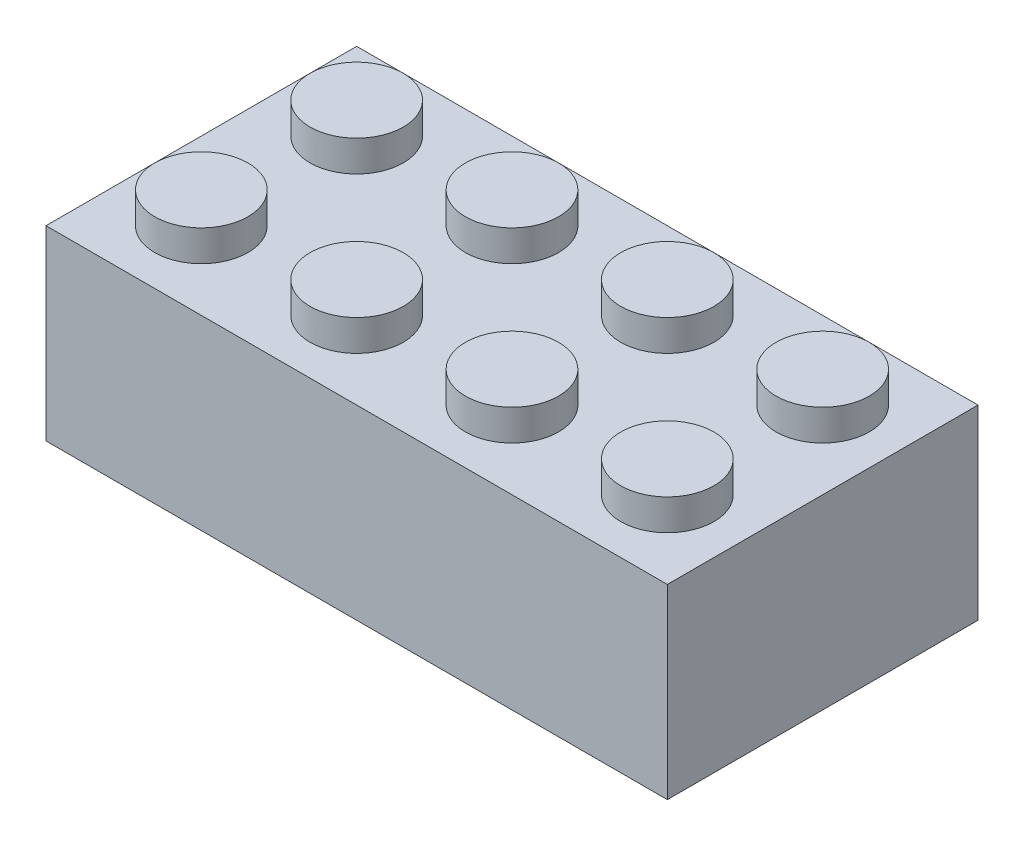
ISO-10303-21;
HEADER;
FILE_DESCRIPTION(('STEP AP214'),'2;1');
FILE_NAME('part.step','',(''),(''),'','','');
FILE_SCHEMA(('AUTOMOTIVE_DESIGN { 1 0 10303 214 1 1 1 1 }'));
ENDSEC;
DATA;
#1=APPLICATION_CONTEXT('core data for automotive mechanical design processes');
#2=APPLICATION_PROTOCOL_DEFINITION('international standard','automotive_design',2000,#1);
#3=PRODUCT_CONTEXT('',#1,'mechanical');
#4=PRODUCT('Part','Part','',(#3));
#5=PRODUCT_RELATED_PRODUCT_CATEGORY('part','',(#4));
#6=PRODUCT_DEFINITION_FORMATION('','',#4);
#7=PRODUCT_DEFINITION_CONTEXT('part definition',#1,'design');
#8=PRODUCT_DEFINITION('design','',#6,#7);
#9=PRODUCT_DEFINITION_SHAPE('','',#8);
#10=(LENGTH_UNIT() NAMED_UNIT(*) SI_UNIT(.MILLI.,.METRE.));
#11=(NAMED_UNIT(*) PLANE_ANGLE_UNIT() SI_UNIT($,.RADIAN.));
#12=(NAMED_UNIT(*) SI_UNIT($,.STERADIAN.) SOLID_ANGLE_UNIT());
#13=UNCERTAINTY_MEASURE_WITH_UNIT(LENGTH_MEASURE(1.E-05),#10,'distance_accuracy_value','');
#14=(GEOMETRIC_REPRESENTATION_CONTEXT(3) GLOBAL_UNCERTAINTY_ASSIGNED_CONTEXT((#13)) GLOBAL_UNIT_ASSIGNED_CONTEXT((#10,
#11,#12)) REPRESENTATION_CONTEXT('',''));
#15=CARTESIAN_POINT('',(0.,0.,0.));
#16=DIRECTION('',(0.,0.,1.));
#17=DIRECTION('',(1.,0.,0.));
#18=AXIS2_PLACEMENT_3D('',#15,#16,#17);
#19=CARTESIAN_POINT('',(28.,4.8,4.));
#20=DIRECTION('',(-1.,0.,0.));
#21=DIRECTION('',(0.,0.,1.));
#22=AXIS2_PLACEMENT_3D('',#19,#20,#21);
#23=PLANE('',#22);
#24=DIRECTION('',(0.,0.,-1.));
#25=VECTOR('',#24,1.);
#26=CARTESIAN_POINT('',(28.,0.,4.));
#27=LINE('',#26,#25);
#28=CARTESIAN_POINT('',(28.,0.,12.));
#29=VERTEX_POINT('',#28);
#30=CARTESIAN_POINT('',(28.,0.,-4.));
#31=VERTEX_POINT('',#30);
#32=EDGE_CURVE('E185',#29,#31,#27,.T.);
#33=ORIENTED_EDGE('',*,*,#32,.T.);
#34=DIRECTION('',(0.,-1.,0.));
#35=VECTOR('',#34,1.);
#36=CARTESIAN_POINT('',(28.,4.8,-4.));
#37=LINE('',#36,#35);
#38=CARTESIAN_POINT('',(28.,9.6,-4.));
#39=VERTEX_POINT('',#38);
#40=EDGE_CURVE('E243',#39,#31,#37,.T.);
#41=ORIENTED_EDGE('',*,*,#40,.F.);
#42=DIRECTION('',(0.,0.,-1.));
#43=VECTOR('',#42,1.);
#44=CARTESIAN_POINT('',(28.,9.6,4.));
#45=LINE('',#44,#43);
#46=CARTESIAN_POINT('',(28.,9.6,12.));
#47=VERTEX_POINT('',#46);
#48=EDGE_CURVE('E11',#47,#39,#45,.T.);
#49=ORIENTED_EDGE('',*,*,#48,.F.);
#50=DIRECTION('',(0.,1.,0.));
#51=VECTOR('',#50,1.);
#52=CARTESIAN_POINT('',(28.,4.8,12.));
#53=LINE('',#52,#51);
#54=EDGE_CURVE('E208',#29,#47,#53,.T.);
#55=ORIENTED_EDGE('',*,*,#54,.F.);
#56=EDGE_LOOP('',(#33,#41,#49,#55));
#57=FACE_BOUND('',#56,.T.);
#58=ADVANCED_FACE('F17',(#57),#23,.F.);
#59=CARTESIAN_POINT('',(12.,9.6,4.));
#60=DIRECTION('',(0.,-1.,0.));
#61=DIRECTION('',(0.,0.,-1.));
#62=AXIS2_PLACEMENT_3D('',#59,#60,#61);
#63=PLANE('',#62);
#64=ORIENTED_EDGE('',*,*,#48,.T.);
#65=DIRECTION('',(1.,0.,0.));
#66=VECTOR('',#65,1.);
#67=CARTESIAN_POINT('',(12.,9.6,-4.));
#68=LINE('',#67,#66);
#69=CARTESIAN_POINT('',(-4.,9.6,-4.));
#70=VERTEX_POINT('',#69);
#71=EDGE_CURVE('E250',#70,#39,#68,.T.);
#72=ORIENTED_EDGE('',*,*,#71,.F.);
#73=DIRECTION('',(0.,0.,-1.));
#74=VECTOR('',#73,1.);
#75=CARTESIAN_POINT('',(-4.,9.6,4.));
#76=LINE('',#75,#74);
#77=CARTESIAN_POINT('',(-4.,9.6,12.));
#78=VERTEX_POINT('',#77);
#79=EDGE_CURVE('E27',#78,#70,#76,.T.);
#80=ORIENTED_EDGE('',*,*,#79,.F.);
#81=DIRECTION('',(-1.,0.,0.));
#82=VECTOR('',#81,1.);
#83=CARTESIAN_POINT('',(12.,9.6,12.));
#84=LINE('',#83,#82);
#85=EDGE_CURVE('E184',#47,#78,#84,.T.);
#86=ORIENTED_EDGE('',*,*,#85,.F.);
#87=EDGE_LOOP('',(#64,#72,#80,#86));
#88=FACE_BOUND('',#87,.T.);
#89=CARTESIAN_POINT('',(0.,9.6,0.));
#90=DIRECTION('',(0.,-1.,0.));
#91=DIRECTION('',(1.,0.,0.));
#92=AXIS2_PLACEMENT_3D('',#89,#90,#91);
#93=CIRCLE('',#92,2.4);
#94=CARTESIAN_POINT('',(-2.4,9.6,0.));
#95=VERTEX_POINT('',#94);
#96=EDGE_CURVE('E211',#95,#95,#93,.T.);
#97=ORIENTED_EDGE('',*,*,#96,.T.);
#98=EDGE_LOOP('',(#97));
#99=FACE_BOUND('',#98,.T.);
#100=CARTESIAN_POINT('',(0.,9.6,8.));
#101=DIRECTION('',(0.,-1.,0.));
#102=DIRECTION('',(1.,0.,0.));
#103=AXIS2_PLACEMENT_3D('',#100,#101,#102);
#104=CIRCLE('',#103,2.4);
#105=CARTESIAN_POINT('',(-2.4,9.6,8.));
#106=VERTEX_POINT('',#105);
#107=EDGE_CURVE('E249',#106,#106,#104,.T.);
#108=ORIENTED_EDGE('',*,*,#107,.T.);
#109=EDGE_LOOP('',(#108));
#110=FACE_BOUND('',#109,.T.);
#111=CARTESIAN_POINT('',(8.,9.6,0.));
#112=DIRECTION('',(0.,-1.,0.));
#113=DIRECTION('',(1.,0.,0.));
#114=AXIS2_PLACEMENT_3D('',#111,#112,#113);
#115=CIRCLE('',#114,2.4);
#116=CARTESIAN_POINT('',(5.6,9.6,0.));
#117=VERTEX_POINT('',#116);
#118=EDGE_CURVE('E172',#117,#117,#115,.T.);
#119=ORIENTED_EDGE('',*,*,#118,.T.);
#120=EDGE_LOOP('',(#119));
#121=FACE_BOUND('',#120,.T.);
#122=CARTESIAN_POINT('',(8.,9.6,8.));
#123=DIRECTION('',(0.,-1.,0.));
#124=DIRECTION('',(1.,0.,0.));
#125=AXIS2_PLACEMENT_3D('',#122,#123,#124);
#126=CIRCLE('',#125,2.4);
#127=CARTESIAN_POINT('',(5.6,9.6,8.));
#128=VERTEX_POINT('',#127);
#129=EDGE_CURVE('E165',#128,#128,#126,.T.);
#130=ORIENTED_EDGE('',*,*,#129,.T.);
#131=EDGE_LOOP('',(#130));
#132=FACE_BOUND('',#131,.T.);
#133=CARTESIAN_POINT('',(16.,9.6,0.));
#134=DIRECTION('',(0.,-1.,0.));
#135=DIRECTION('',(1.,0.,0.));
#136=AXIS2_PLACEMENT_3D('',#133,#134,#135);
#137=CIRCLE('',#136,2.4);
#138=CARTESIAN_POINT('',(13.6,9.6,0.));
#139=VERTEX_POINT('',#138);
#140=EDGE_CURVE('E174',#139,#139,#137,.T.);
#141=ORIENTED_EDGE('',*,*,#140,.T.);
#142=EDGE_LOOP('',(#141));
#143=FACE_BOUND('',#142,.T.);
#144=CARTESIAN_POINT('',(16.,9.6,8.));
#145=DIRECTION('',(0.,-1.,0.));
#146=DIRECTION('',(1.,0.,0.));
#147=AXIS2_PLACEMENT_3D('',#144,#145,#146);
#148=CIRCLE('',#147,2.4);
#149=CARTESIAN_POINT('',(13.6,9.6,8.));
#150=VERTEX_POINT('',#149);
#151=EDGE_CURVE('E260',#150,#150,#148,.T.);
#152=ORIENTED_EDGE('',*,*,#151,.T.);
#153=EDGE_LOOP('',(#152));
#154=FACE_BOUND('',#153,.T.);
#155=CARTESIAN_POINT('',(24.,9.6,0.));
#156=DIRECTION('',(0.,-1.,0.));
#157=DIRECTION('',(1.,0.,0.));
#158=AXIS2_PLACEMENT_3D('',#155,#156,#157);
#159=CIRCLE('',#158,2.4);
#160=CARTESIAN_POINT('',(21.6,9.6,0.));
#161=VERTEX_POINT('',#160);
#162=EDGE_CURVE('E220',#161,#161,#159,.T.);
#163=ORIENTED_EDGE('',*,*,#162,.T.);
#164=EDGE_LOOP('',(#163));
#165=FACE_BOUND('',#164,.T.);
#166=CARTESIAN_POINT('',(24.,9.6,8.));
#167=DIRECTION('',(0.,-1.,0.));
#168=DIRECTION('',(1.,0.,0.));
#169=AXIS2_PLACEMENT_3D('',#166,#167,#168);
#170=CIRCLE('',#169,2.4);
#171=CARTESIAN_POINT('',(21.6,9.6,8.));
#172=VERTEX_POINT('',#171);
#173=EDGE_CURVE('E191',#172,#172,#170,.T.);
#174=ORIENTED_EDGE('',*,*,#173,.T.);
#175=EDGE_LOOP('',(#174));
#176=FACE_BOUND('',#175,.T.);
#177=ADVANCED_FACE('F166',(#88,#99,#110,#121,#132,#143,#154,#165,#176),#63,.F.);
#178=CARTESIAN_POINT('',(-4.,4.8,4.));
#179=DIRECTION('',(1.,0.,0.));
#180=DIRECTION('',(0.,0.,-1.));
#181=AXIS2_PLACEMENT_3D('',#178,#179,#180);
#182=PLANE('',#181);
#183=ORIENTED_EDGE('',*,*,#79,.T.);
#184=DIRECTION('',(0.,1.,0.));
#185=VECTOR('',#184,1.);
#186=CARTESIAN_POINT('',(-4.,4.8,-4.));
#187=LINE('',#186,#185);
#188=CARTESIAN_POINT('',(-4.,0.,-4.));
#189=VERTEX_POINT('',#188);
#190=EDGE_CURVE('E253',#189,#70,#187,.T.);
#191=ORIENTED_EDGE('',*,*,#190,.F.);
#192=DIRECTION('',(0.,0.,-1.));
#193=VECTOR('',#192,1.);
#194=CARTESIAN_POINT('',(-4.,0.,4.));
#195=LINE('',#194,#193);
#196=CARTESIAN_POINT('',(-4.,0.,12.));
#197=VERTEX_POINT('',#196);
#198=EDGE_CURVE('E188',#197,#189,#195,.T.);
#199=ORIENTED_EDGE('',*,*,#198,.F.);
#200=DIRECTION('',(0.,-1.,0.));
#201=VECTOR('',#200,1.);
#202=CARTESIAN_POINT('',(-4.,4.8,12.));
#203=LINE('',#202,#201);
#204=EDGE_CURVE('E180',#78,#197,#203,.T.);
#205=ORIENTED_EDGE('',*,*,#204,.F.);
#206=EDGE_LOOP('',(#183,#191,#199,#205));
#207=FACE_BOUND('',#206,.T.);
#208=ADVANCED_FACE('F299',(#207),#182,.F.);
#209=CARTESIAN_POINT('',(12.,0.,4.));
#210=DIRECTION('',(0.,1.,0.));
#211=DIRECTION('',(0.,0.,1.));
#212=AXIS2_PLACEMENT_3D('',#209,#210,#211);
#213=PLANE('',#212);
#214=ORIENTED_EDGE('',*,*,#198,.T.);
#215=DIRECTION('',(-1.,0.,0.));
#216=VECTOR('',#215,1.);
#217=CARTESIAN_POINT('',(12.,0.,-4.));
#218=LINE('',#217,#216);
#219=EDGE_CURVE('E255',#31,#189,#218,.T.);
#220=ORIENTED_EDGE('',*,*,#219,.F.);
#221=ORIENTED_EDGE('',*,*,#32,.F.);
#222=DIRECTION('',(1.,0.,0.));
#223=VECTOR('',#222,1.);
#224=CARTESIAN_POINT('',(12.,0.,12.));
#225=LINE('',#224,#223);
#226=EDGE_CURVE('E183',#197,#29,#225,.T.);
#227=ORIENTED_EDGE('',*,*,#226,.F.);
#228=EDGE_LOOP('',(#214,#220,#221,#227));
#229=FACE_BOUND('',#228,.T.);
#230=CARTESIAN_POINT('',(0.,0.,0.));
#231=DIRECTION('',(0.,1.,0.));
#232=DIRECTION('',(1.,0.,0.));
#233=AXIS2_PLACEMENT_3D('',#230,#231,#232);
#234=CIRCLE('',#233,2.4);
#235=CARTESIAN_POINT('',(-2.4,0.,0.));
#236=VERTEX_POINT('',#235);
#237=EDGE_CURVE('E195',#236,#236,#234,.T.);
#238=ORIENTED_EDGE('',*,*,#237,.T.);
#239=EDGE_LOOP('',(#238));
#240=FACE_BOUND('',#239,.T.);
#241=CARTESIAN_POINT('',(0.,0.,8.));
#242=DIRECTION('',(0.,1.,0.));
#243=DIRECTION('',(1.,0.,0.));
#244=AXIS2_PLACEMENT_3D('',#241,#242,#243);
#245=CIRCLE('',#244,2.4);
#246=CARTESIAN_POINT('',(-2.4,0.,8.));
#247=VERTEX_POINT('',#246);
#248=EDGE_CURVE('E196',#247,#247,#245,.T.);
#249=ORIENTED_EDGE('',*,*,#248,.T.);
#250=EDGE_LOOP('',(#249));
#251=FACE_BOUND('',#250,.T.);
#252=CARTESIAN_POINT('',(8.,0.,0.));
#253=DIRECTION('',(0.,1.,0.));
#254=DIRECTION('',(1.,0.,0.));
#255=AXIS2_PLACEMENT_3D('',#252,#253,#254);
#256=CIRCLE('',#255,2.4);
#257=CARTESIAN_POINT('',(5.6,0.,0.));
#258=VERTEX_POINT('',#257);
#259=EDGE_CURVE('E228',#258,#258,#256,.T.);
#260=ORIENTED_EDGE('',*,*,#259,.T.);
#261=EDGE_LOOP('',(#260));
#262=FACE_BOUND('',#261,.T.);
#263=CARTESIAN_POINT('',(8.,0.,8.));
#264=DIRECTION('',(0.,1.,0.));
#265=DIRECTION('',(1.,0.,0.));
#266=AXIS2_PLACEMENT_3D('',#263,#264,#265);
#267=CIRCLE('',#266,2.4);
#268=CARTESIAN_POINT('',(5.6,0.,8.));
#269=VERTEX_POINT('',#268);
#270=EDGE_CURVE('E206',#269,#269,#267,.T.);
#271=ORIENTED_EDGE('',*,*,#270,.T.);
#272=EDGE_LOOP('',(#271));
#273=FACE_BOUND('',#272,.T.);
#274=CARTESIAN_POINT('',(16.,0.,0.));
#275=DIRECTION('',(0.,1.,0.));
#276=DIRECTION('',(1.,0.,0.));
#277=AXIS2_PLACEMENT_3D('',#274,#275,#276);
#278=CIRCLE('',#277,2.4);
#279=CARTESIAN_POINT('',(13.6,0.,0.));
#280=VERTEX_POINT('',#279);
#281=EDGE_CURVE('E207',#280,#280,#278,.T.);
#282=ORIENTED_EDGE('',*,*,#281,.T.);
#283=EDGE_LOOP('',(#282));
#284=FACE_BOUND('',#283,.T.);
#285=CARTESIAN_POINT('',(16.,0.,8.));
#286=DIRECTION('',(0.,1.,0.));
#287=DIRECTION('',(1.,0.,0.));
#288=AXIS2_PLACEMENT_3D('',#285,#286,#287);
#289=CIRCLE('',#288,2.4);
#290=CARTESIAN_POINT('',(13.6,0.,8.));
#291=VERTEX_POINT('',#290);
#292=EDGE_CURVE('E262',#291,#291,#289,.T.);
#293=ORIENTED_EDGE('',*,*,#292,.T.);
#294=EDGE_LOOP('',(#293));
#295=FACE_BOUND('',#294,.T.);
#296=CARTESIAN_POINT('',(24.,0.,0.));
#297=DIRECTION('',(0.,1.,0.));
#298=DIRECTION('',(1.,0.,0.));
#299=AXIS2_PLACEMENT_3D('',#296,#297,#298);
#300=CIRCLE('',#299,2.4);
#301=CARTESIAN_POINT('',(21.6,0.,0.));
#302=VERTEX_POINT('',#301);
#303=EDGE_CURVE('E212',#302,#302,#300,.T.);
#304=ORIENTED_EDGE('',*,*,#303,.T.);
#305=EDGE_LOOP('',(#304));
#306=FACE_BOUND('',#305,.T.);
#307=CARTESIAN_POINT('',(24.,0.,8.));
#308=DIRECTION('',(0.,1.,0.));
#309=DIRECTION('',(1.,0.,0.));
#310=AXIS2_PLACEMENT_3D('',#307,#308,#309);
#311=CIRCLE('',#310,2.4);
#312=CARTESIAN_POINT('',(21.6,0.,8.));
#313=VERTEX_POINT('',#312);
#314=EDGE_CURVE('E245',#313,#313,#311,.T.);
#315=ORIENTED_EDGE('',*,*,#314,.T.);
#316=EDGE_LOOP('',(#315));
#317=FACE_BOUND('',#316,.T.);
#318=CARTESIAN_POINT('',(4.,0.,4.));
#319=DIRECTION('',(0.,1.,0.));
#320=DIRECTION('',(1.,0.,0.));
#321=AXIS2_PLACEMENT_3D('',#318,#319,#320);
#322=CIRCLE('',#321,2.4);
#323=CARTESIAN_POINT('',(1.6,0.,4.));
#324=VERTEX_POINT('',#323);
#325=EDGE_CURVE('E202',#324,#324,#322,.T.);
#326=ORIENTED_EDGE('',*,*,#325,.T.);
#327=EDGE_LOOP('',(#326));
#328=FACE_BOUND('',#327,.T.);
#329=CARTESIAN_POINT('',(12.,0.,4.));
#330=DIRECTION('',(0.,1.,0.));
#331=DIRECTION('',(1.,0.,0.));
#332=AXIS2_PLACEMENT_3D('',#329,#330,#331);
#333=CIRCLE('',#332,2.4);
#334=CARTESIAN_POINT('',(9.6,0.,4.));
#335=VERTEX_POINT('',#334);
#336=EDGE_CURVE('E203',#335,#335,#333,.T.);
#337=ORIENTED_EDGE('',*,*,#336,.T.);
#338=EDGE_LOOP('',(#337));
#339=FACE_BOUND('',#338,.T.);
#340=CARTESIAN_POINT('',(20.,0.,4.));
#341=DIRECTION('',(0.,1.,0.));
#342=DIRECTION('',(1.,0.,0.));
#343=AXIS2_PLACEMENT_3D('',#340,#341,#342);
#344=CIRCLE('',#343,2.4);
#345=CARTESIAN_POINT('',(17.6,0.,4.));
#346=VERTEX_POINT('',#345);
#347=EDGE_CURVE('E197',#346,#346,#344,.T.);
#348=ORIENTED_EDGE('',*,*,#347,.T.);
#349=EDGE_LOOP('',(#348));
#350=FACE_BOUND('',#349,.T.);
#351=ADVANCED_FACE('F331',(#229,#240,#251,#262,#273,#284,#295,#306,#317,#328,#339,#350),#213,.F.);
#352=CARTESIAN_POINT('',(12.,4.8,-4.));
#353=DIRECTION('',(0.,0.,1.));
#354=DIRECTION('',(1.,0.,0.));
#355=AXIS2_PLACEMENT_3D('',#352,#353,#354);
#356=PLANE('',#355);
#357=ORIENTED_EDGE('',*,*,#40,.T.);
#358=ORIENTED_EDGE('',*,*,#219,.T.);
#359=ORIENTED_EDGE('',*,*,#190,.T.);
#360=ORIENTED_EDGE('',*,*,#71,.T.);
#361=EDGE_LOOP('',(#357,#358,#359,#360));
#362=FACE_BOUND('',#361,.T.);
#363=ADVANCED_FACE('F328',(#362),#356,.F.);
#364=CARTESIAN_POINT('',(12.,4.8,12.));
#365=DIRECTION('',(0.,0.,1.));
#366=DIRECTION('',(1.,0.,0.));
#367=AXIS2_PLACEMENT_3D('',#364,#365,#366);
#368=PLANE('',#367);
#369=ORIENTED_EDGE('',*,*,#54,.T.);
#370=ORIENTED_EDGE('',*,*,#85,.T.);
#371=ORIENTED_EDGE('',*,*,#204,.T.);
#372=ORIENTED_EDGE('',*,*,#226,.T.);
#373=EDGE_LOOP('',(#369,#370,#371,#372));
#374=FACE_BOUND('',#373,.T.);
#375=ADVANCED_FACE('F19',(#374),#368,.T.);
#376=CARTESIAN_POINT('',(0.,11.2,0.));
#377=DIRECTION('',(0.,1.,0.));
#378=DIRECTION('',(1.,0.,0.));
#379=AXIS2_PLACEMENT_3D('',#376,#377,#378);
#380=PLANE('',#379);
#381=CARTESIAN_POINT('',(0.,11.2,0.));
#382=DIRECTION('',(0.,1.,0.));
#383=DIRECTION('',(1.,0.,0.));
#384=AXIS2_PLACEMENT_3D('',#381,#382,#383);
#385=CIRCLE('',#384,2.4);
#386=CARTESIAN_POINT('',(2.4,11.2,0.));
#387=VERTEX_POINT('',#386);
#388=EDGE_CURVE('E235',#387,#387,#385,.T.);
#389=ORIENTED_EDGE('',*,*,#388,.T.);
#390=EDGE_LOOP('',(#389));
#391=FACE_BOUND('',#390,.T.);
#392=ADVANCED_FACE('F348',(#391),#380,.T.);
#393=CARTESIAN_POINT('',(0.,10.15,0.));
#394=DIRECTION('',(0.,-1.,0.));
#395=DIRECTION('',(1.,0.,0.));
#396=AXIS2_PLACEMENT_3D('',#393,#394,#395);
#397=CYLINDRICAL_SURFACE('',#396,2.4);
#398=ORIENTED_EDGE('',*,*,#96,.F.);
#399=EDGE_LOOP('',(#398));
#400=FACE_BOUND('',#399,.T.);
#401=ORIENTED_EDGE('',*,*,#388,.F.);
#402=EDGE_LOOP('',(#401));
#403=FACE_BOUND('',#402,.T.);
#404=ADVANCED_FACE('F320',(#400,#403),#397,.T.);
#405=CARTESIAN_POINT('',(0.,11.2,8.));
#406=DIRECTION('',(0.,1.,0.));
#407=DIRECTION('',(1.,0.,0.));
#408=AXIS2_PLACEMENT_3D('',#405,#406,#407);
#409=PLANE('',#408);
#410=CARTESIAN_POINT('',(0.,11.2,8.));
#411=DIRECTION('',(0.,1.,0.));
#412=DIRECTION('',(1.,0.,0.));
#413=AXIS2_PLACEMENT_3D('',#410,#411,#412);
#414=CIRCLE('',#413,2.4);
#415=CARTESIAN_POINT('',(2.4,11.2,8.));
#416=VERTEX_POINT('',#415);
#417=EDGE_CURVE('E232',#416,#416,#414,.T.);
#418=ORIENTED_EDGE('',*,*,#417,.T.);
#419=EDGE_LOOP('',(#418));
#420=FACE_BOUND('',#419,.T.);
#421=ADVANCED_FACE('F316',(#420),#409,.T.);
#422=CARTESIAN_POINT('',(0.,10.15,8.));
#423=DIRECTION('',(0.,-1.,0.));
#424=DIRECTION('',(1.,0.,0.));
#425=AXIS2_PLACEMENT_3D('',#422,#423,#424);
#426=CYLINDRICAL_SURFACE('',#425,2.4);
#427=ORIENTED_EDGE('',*,*,#107,.F.);
#428=EDGE_LOOP('',(#427));
#429=FACE_BOUND('',#428,.T.);
#430=ORIENTED_EDGE('',*,*,#417,.F.);
#431=EDGE_LOOP('',(#430));
#432=FACE_BOUND('',#431,.T.);
#433=ADVANCED_FACE('F319',(#429,#432),#426,.T.);
#434=CARTESIAN_POINT('',(8.,11.2,0.));
#435=DIRECTION('',(0.,1.,0.));
#436=DIRECTION('',(1.,0.,0.));
#437=AXIS2_PLACEMENT_3D('',#434,#435,#436);
#438=PLANE('',#437);
#439=CARTESIAN_POINT('',(8.,11.2,0.));
#440=DIRECTION('',(0.,1.,0.));
#441=DIRECTION('',(1.,0.,0.));
#442=AXIS2_PLACEMENT_3D('',#439,#440,#441);
#443=CIRCLE('',#442,2.4);
#444=CARTESIAN_POINT('',(10.4,11.2,0.));
#445=VERTEX_POINT('',#444);
#446=EDGE_CURVE('E169',#445,#445,#443,.T.);
#447=ORIENTED_EDGE('',*,*,#446,.T.);
#448=EDGE_LOOP('',(#447));
#449=FACE_BOUND('',#448,.T.);
#450=ADVANCED_FACE('F345',(#449),#438,.T.);
#451=CARTESIAN_POINT('',(8.,10.15,0.));
#452=DIRECTION('',(0.,-1.,0.));
#453=DIRECTION('',(1.,0.,0.));
#454=AXIS2_PLACEMENT_3D('',#451,#452,#453);
#455=CYLINDRICAL_SURFACE('',#454,2.4);
#456=ORIENTED_EDGE('',*,*,#118,.F.);
#457=EDGE_LOOP('',(#456));
#458=FACE_BOUND('',#457,.T.);
#459=ORIENTED_EDGE('',*,*,#446,.F.);
#460=EDGE_LOOP('',(#459));
#461=FACE_BOUND('',#460,.T.);
#462=ADVANCED_FACE('F364',(#458,#461),#455,.T.);
#463=CARTESIAN_POINT('',(8.,11.2,8.));
#464=DIRECTION('',(0.,1.,0.));
#465=DIRECTION('',(1.,0.,0.));
#466=AXIS2_PLACEMENT_3D('',#463,#464,#465);
#467=PLANE('',#466);
#468=CARTESIAN_POINT('',(8.,11.2,8.));
#469=DIRECTION('',(0.,1.,0.));
#470=DIRECTION('',(1.,0.,0.));
#471=AXIS2_PLACEMENT_3D('',#468,#469,#470);
#472=CIRCLE('',#471,2.4);
#473=CARTESIAN_POINT('',(10.4,11.2,8.));
#474=VERTEX_POINT('',#473);
#475=EDGE_CURVE('E170',#474,#474,#472,.T.);
#476=ORIENTED_EDGE('',*,*,#475,.T.);
#477=EDGE_LOOP('',(#476));
#478=FACE_BOUND('',#477,.T.);
#479=ADVANCED_FACE('F367',(#478),#467,.T.);
#480=CARTESIAN_POINT('',(8.,10.15,8.));
#481=DIRECTION('',(0.,-1.,0.));
#482=DIRECTION('',(1.,0.,0.));
#483=AXIS2_PLACEMENT_3D('',#480,#481,#482);
#484=CYLINDRICAL_SURFACE('',#483,2.4);
#485=ORIENTED_EDGE('',*,*,#129,.F.);
#486=EDGE_LOOP('',(#485));
#487=FACE_BOUND('',#486,.T.);
#488=ORIENTED_EDGE('',*,*,#475,.F.);
#489=EDGE_LOOP('',(#488));
#490=FACE_BOUND('',#489,.T.);
#491=ADVANCED_FACE('F389',(#487,#490),#484,.T.);
#492=CARTESIAN_POINT('',(16.,11.2,0.));
#493=DIRECTION('',(0.,1.,0.));
#494=DIRECTION('',(1.,0.,0.));
#495=AXIS2_PLACEMENT_3D('',#492,#493,#494);
#496=PLANE('',#495);
#497=CARTESIAN_POINT('',(16.,11.2,0.));
#498=DIRECTION('',(0.,1.,0.));
#499=DIRECTION('',(1.,0.,0.));
#500=AXIS2_PLACEMENT_3D('',#497,#498,#499);
#501=CIRCLE('',#500,2.4);
#502=CARTESIAN_POINT('',(18.4,11.2,0.));
#503=VERTEX_POINT('',#502);
#504=EDGE_CURVE('E21',#503,#503,#501,.T.);
#505=ORIENTED_EDGE('',*,*,#504,.T.);
#506=EDGE_LOOP('',(#505));
#507=FACE_BOUND('',#506,.T.);
#508=ADVANCED_FACE('F314',(#507),#496,.T.);
#509=CARTESIAN_POINT('',(16.,10.15,0.));
#510=DIRECTION('',(0.,-1.,0.));
#511=DIRECTION('',(1.,0.,0.));
#512=AXIS2_PLACEMENT_3D('',#509,#510,#511);
#513=CYLINDRICAL_SURFACE('',#512,2.4);
#514=ORIENTED_EDGE('',*,*,#140,.F.);
#515=EDGE_LOOP('',(#514));
#516=FACE_BOUND('',#515,.T.);
#517=ORIENTED_EDGE('',*,*,#504,.F.);
#518=EDGE_LOOP('',(#517));
#519=FACE_BOUND('',#518,.T.);
#520=ADVANCED_FACE('F310',(#516,#519),#513,.T.);
#521=CARTESIAN_POINT('',(16.,11.2,8.));
#522=DIRECTION('',(0.,1.,0.));
#523=DIRECTION('',(1.,0.,0.));
#524=AXIS2_PLACEMENT_3D('',#521,#522,#523);
#525=PLANE('',#524);
#526=CARTESIAN_POINT('',(16.,11.2,8.));
#527=DIRECTION('',(0.,1.,0.));
#528=DIRECTION('',(1.,0.,0.));
#529=AXIS2_PLACEMENT_3D('',#526,#527,#528);
#530=CIRCLE('',#529,2.4);
#531=CARTESIAN_POINT('',(18.4,11.2,8.));
#532=VERTEX_POINT('',#531);
#533=EDGE_CURVE('E222',#532,#532,#530,.T.);
#534=ORIENTED_EDGE('',*,*,#533,.T.);
#535=EDGE_LOOP('',(#534));
#536=FACE_BOUND('',#535,.T.);
#537=ADVANCED_FACE('F313',(#536),#525,.T.);
#538=CARTESIAN_POINT('',(16.,10.15,8.));
#539=DIRECTION('',(0.,-1.,0.));
#540=DIRECTION('',(1.,0.,0.));
#541=AXIS2_PLACEMENT_3D('',#538,#539,#540);
#542=CYLINDRICAL_SURFACE('',#541,2.4);
#543=ORIENTED_EDGE('',*,*,#151,.F.);
#544=EDGE_LOOP('',(#543));
#545=FACE_BOUND('',#544,.T.);
#546=ORIENTED_EDGE('',*,*,#533,.F.);
#547=EDGE_LOOP('',(#546));
#548=FACE_BOUND('',#547,.T.);
#549=ADVANCED_FACE('F403',(#545,#548),#542,.T.);
#550=CARTESIAN_POINT('',(24.,11.2,0.));
#551=DIRECTION('',(0.,1.,0.));
#552=DIRECTION('',(1.,0.,0.));
#553=AXIS2_PLACEMENT_3D('',#550,#551,#552);
#554=PLANE('',#553);
#555=CARTESIAN_POINT('',(24.,11.2,0.));
#556=DIRECTION('',(0.,1.,0.));
#557=DIRECTION('',(1.,0.,0.));
#558=AXIS2_PLACEMENT_3D('',#555,#556,#557);
#559=CIRCLE('',#558,2.4);
#560=CARTESIAN_POINT('',(26.4,11.2,0.));
#561=VERTEX_POINT('',#560);
#562=EDGE_CURVE('E223',#561,#561,#559,.T.);
#563=ORIENTED_EDGE('',*,*,#562,.T.);
#564=EDGE_LOOP('',(#563));
#565=FACE_BOUND('',#564,.T.);
#566=ADVANCED_FACE('F400',(#565),#554,.T.);
#567=CARTESIAN_POINT('',(24.,10.15,0.));
#568=DIRECTION('',(0.,-1.,0.));
#569=DIRECTION('',(1.,0.,0.));
#570=AXIS2_PLACEMENT_3D('',#567,#568,#569);
#571=CYLINDRICAL_SURFACE('',#570,2.4);
#572=ORIENTED_EDGE('',*,*,#162,.F.);
#573=EDGE_LOOP('',(#572));
#574=FACE_BOUND('',#573,.T.);
#575=ORIENTED_EDGE('',*,*,#562,.F.);
#576=EDGE_LOOP('',(#575));
#577=FACE_BOUND('',#576,.T.);
#578=ADVANCED_FACE('F402',(#574,#577),#571,.T.);
#579=CARTESIAN_POINT('',(24.,11.2,8.));
#580=DIRECTION('',(0.,1.,0.));
#581=DIRECTION('',(1.,0.,0.));
#582=AXIS2_PLACEMENT_3D('',#579,#580,#581);
#583=PLANE('',#582);
#584=CARTESIAN_POINT('',(24.,11.2,8.));
#585=DIRECTION('',(0.,1.,0.));
#586=DIRECTION('',(1.,0.,0.));
#587=AXIS2_PLACEMENT_3D('',#584,#585,#586);
#588=CIRCLE('',#587,2.4);
#589=CARTESIAN_POINT('',(26.4,11.2,8.));
#590=VERTEX_POINT('',#589);
#591=EDGE_CURVE('E189',#590,#590,#588,.T.);
#592=ORIENTED_EDGE('',*,*,#591,.T.);
#593=EDGE_LOOP('',(#592));
#594=FACE_BOUND('',#593,.T.);
#595=ADVANCED_FACE('F409',(#594),#583,.T.);
#596=CARTESIAN_POINT('',(24.,10.15,8.));
#597=DIRECTION('',(0.,-1.,0.));
#598=DIRECTION('',(1.,0.,0.));
#599=AXIS2_PLACEMENT_3D('',#596,#597,#598);
#600=CYLINDRICAL_SURFACE('',#599,2.4);
#601=ORIENTED_EDGE('',*,*,#173,.F.);
#602=EDGE_LOOP('',(#601));
#603=FACE_BOUND('',#602,.T.);
#604=ORIENTED_EDGE('',*,*,#591,.F.);
#605=EDGE_LOOP('',(#604));
#606=FACE_BOUND('',#605,.T.);
#607=ADVANCED_FACE('F386',(#603,#606),#600,.T.);
#608=CARTESIAN_POINT('',(0.,1.6,0.));
#609=DIRECTION('',(0.,1.,0.));
#610=DIRECTION('',(1.,0.,0.));
#611=AXIS2_PLACEMENT_3D('',#608,#609,#610);
#612=PLANE('',#611);
#613=CARTESIAN_POINT('',(0.,1.6,0.));
#614=DIRECTION('',(0.,1.,0.));
#615=DIRECTION('',(1.,0.,0.));
#616=AXIS2_PLACEMENT_3D('',#613,#614,#615);
#617=CIRCLE('',#616,2.4);
#618=CARTESIAN_POINT('',(2.4,1.6,0.));
#619=VERTEX_POINT('',#618);
#620=EDGE_CURVE('E192',#619,#619,#617,.T.);
#621=ORIENTED_EDGE('',*,*,#620,.F.);
#622=EDGE_LOOP('',(#621));
#623=FACE_BOUND('',#622,.T.);
#624=ADVANCED_FACE('F382',(#623),#612,.F.);
#625=CARTESIAN_POINT('',(0.,0.55,0.));
#626=DIRECTION('',(0.,-1.,0.));
#627=DIRECTION('',(1.,0.,0.));
#628=AXIS2_PLACEMENT_3D('',#625,#626,#627);
#629=CYLINDRICAL_SURFACE('',#628,2.4);
#630=ORIENTED_EDGE('',*,*,#620,.T.);
#631=EDGE_LOOP('',(#630));
#632=FACE_BOUND('',#631,.T.);
#633=ORIENTED_EDGE('',*,*,#237,.F.);
#634=EDGE_LOOP('',(#633));
#635=FACE_BOUND('',#634,.T.);
#636=ADVANCED_FACE('F385',(#632,#635),#629,.F.);
#637=CARTESIAN_POINT('',(0.,1.6,8.));
#638=DIRECTION('',(0.,1.,0.));
#639=DIRECTION('',(1.,0.,0.));
#640=AXIS2_PLACEMENT_3D('',#637,#638,#639);
#641=PLANE('',#640);
#642=CARTESIAN_POINT('',(0.,1.6,8.));
#643=DIRECTION('',(0.,1.,0.));
#644=DIRECTION('',(1.,0.,0.));
#645=AXIS2_PLACEMENT_3D('',#642,#643,#644);
#646=CIRCLE('',#645,2.4);
#647=CARTESIAN_POINT('',(2.4,1.6,8.));
#648=VERTEX_POINT('',#647);
#649=EDGE_CURVE('E193',#648,#648,#646,.T.);
#650=ORIENTED_EDGE('',*,*,#649,.F.);
#651=EDGE_LOOP('',(#650));
#652=FACE_BOUND('',#651,.T.);
#653=ADVANCED_FACE('F380',(#652),#641,.F.);
#654=CARTESIAN_POINT('',(0.,0.55,8.));
#655=DIRECTION('',(0.,-1.,0.));
#656=DIRECTION('',(1.,0.,0.));
#657=AXIS2_PLACEMENT_3D('',#654,#655,#656);
#658=CYLINDRICAL_SURFACE('',#657,2.4);
#659=ORIENTED_EDGE('',*,*,#649,.T.);
#660=EDGE_LOOP('',(#659));
#661=FACE_BOUND('',#660,.T.);
#662=ORIENTED_EDGE('',*,*,#248,.F.);
#663=EDGE_LOOP('',(#662));
#664=FACE_BOUND('',#663,.T.);
#665=ADVANCED_FACE('F342',(#661,#664),#658,.F.);
#666=CARTESIAN_POINT('',(8.,1.6,0.));
#667=DIRECTION('',(0.,1.,0.));
#668=DIRECTION('',(1.,0.,0.));
#669=AXIS2_PLACEMENT_3D('',#666,#667,#668);
#670=PLANE('',#669);
#671=CARTESIAN_POINT('',(8.,1.6,0.));
#672=DIRECTION('',(0.,1.,0.));
#673=DIRECTION('',(1.,0.,0.));
#674=AXIS2_PLACEMENT_3D('',#671,#672,#673);
#675=CIRCLE('',#674,2.4);
#676=CARTESIAN_POINT('',(10.4,1.6,0.));
#677=VERTEX_POINT('',#676);
#678=EDGE_CURVE('E217',#677,#677,#675,.T.);
#679=ORIENTED_EDGE('',*,*,#678,.F.);
#680=EDGE_LOOP('',(#679));
#681=FACE_BOUND('',#680,.T.);
#682=ADVANCED_FACE('F339',(#681),#670,.F.);
#683=CARTESIAN_POINT('',(8.,0.55,0.));
#684=DIRECTION('',(0.,-1.,0.));
#685=DIRECTION('',(1.,0.,0.));
#686=AXIS2_PLACEMENT_3D('',#683,#684,#685);
#687=CYLINDRICAL_SURFACE('',#686,2.4);
#688=ORIENTED_EDGE('',*,*,#678,.T.);
#689=EDGE_LOOP('',(#688));
#690=FACE_BOUND('',#689,.T.);
#691=ORIENTED_EDGE('',*,*,#259,.F.);
#692=EDGE_LOOP('',(#691));
#693=FACE_BOUND('',#692,.T.);
#694=ADVANCED_FACE('F326',(#690,#693),#687,.F.);
#695=CARTESIAN_POINT('',(8.,1.6,8.));
#696=DIRECTION('',(0.,1.,0.));
#697=DIRECTION('',(1.,0.,0.));
#698=AXIS2_PLACEMENT_3D('',#695,#696,#697);
#699=PLANE('',#698);
#700=CARTESIAN_POINT('',(8.,1.6,8.));
#701=DIRECTION('',(0.,1.,0.));
#702=DIRECTION('',(1.,0.,0.));
#703=AXIS2_PLACEMENT_3D('',#700,#701,#702);
#704=CIRCLE('',#703,2.4);
#705=CARTESIAN_POINT('',(10.4,1.6,8.));
#706=VERTEX_POINT('',#705);
#707=EDGE_CURVE('E230',#706,#706,#704,.T.);
#708=ORIENTED_EDGE('',*,*,#707,.F.);
#709=EDGE_LOOP('',(#708));
#710=FACE_BOUND('',#709,.T.);
#711=ADVANCED_FACE('F322',(#710),#699,.F.);
#712=CARTESIAN_POINT('',(8.,0.55,8.));
#713=DIRECTION('',(0.,-1.,0.));
#714=DIRECTION('',(1.,0.,0.));
#715=AXIS2_PLACEMENT_3D('',#712,#713,#714);
#716=CYLINDRICAL_SURFACE('',#715,2.4);
#717=ORIENTED_EDGE('',*,*,#707,.T.);
#718=EDGE_LOOP('',(#717));
#719=FACE_BOUND('',#718,.T.);
#720=ORIENTED_EDGE('',*,*,#270,.F.);
#721=EDGE_LOOP('',(#720));
#722=FACE_BOUND('',#721,.T.);
#723=ADVANCED_FACE('F325',(#719,#722),#716,.F.);
#724=CARTESIAN_POINT('',(16.,1.6,0.));
#725=DIRECTION('',(0.,1.,0.));
#726=DIRECTION('',(1.,0.,0.));
#727=AXIS2_PLACEMENT_3D('',#724,#725,#726);
#728=PLANE('',#727);
#729=CARTESIAN_POINT('',(16.,1.6,0.));
#730=DIRECTION('',(0.,1.,0.));
#731=DIRECTION('',(1.,0.,0.));
#732=AXIS2_PLACEMENT_3D('',#729,#730,#731);
#733=CIRCLE('',#732,2.4);
#734=CARTESIAN_POINT('',(18.4,1.6,0.));
#735=VERTEX_POINT('',#734);
#736=EDGE_CURVE('E204',#735,#735,#733,.T.);
#737=ORIENTED_EDGE('',*,*,#736,.F.);
#738=EDGE_LOOP('',(#737));
#739=FACE_BOUND('',#738,.T.);
#740=ADVANCED_FACE('F288',(#739),#728,.F.);
#741=CARTESIAN_POINT('',(16.,0.55,0.));
#742=DIRECTION('',(0.,-1.,0.));
#743=DIRECTION('',(1.,0.,0.));
#744=AXIS2_PLACEMENT_3D('',#741,#742,#743);
#745=CYLINDRICAL_SURFACE('',#744,2.4);
#746=ORIENTED_EDGE('',*,*,#736,.T.);
#747=EDGE_LOOP('',(#746));
#748=FACE_BOUND('',#747,.T.);
#749=ORIENTED_EDGE('',*,*,#281,.F.);
#750=EDGE_LOOP('',(#749));
#751=FACE_BOUND('',#750,.T.);
#752=ADVANCED_FACE('F279',(#748,#751),#745,.F.);
#753=CARTESIAN_POINT('',(16.,1.6,8.));
#754=DIRECTION('',(0.,1.,0.));
#755=DIRECTION('',(1.,0.,0.));
#756=AXIS2_PLACEMENT_3D('',#753,#754,#755);
#757=PLANE('',#756);
#758=CARTESIAN_POINT('',(16.,1.6,8.));
#759=DIRECTION('',(0.,1.,0.));
#760=DIRECTION('',(1.,0.,0.));
#761=AXIS2_PLACEMENT_3D('',#758,#759,#760);
#762=CIRCLE('',#761,2.4);
#763=CARTESIAN_POINT('',(18.4,1.6,8.));
#764=VERTEX_POINT('',#763);
#765=EDGE_CURVE('E239',#764,#764,#762,.T.);
#766=ORIENTED_EDGE('',*,*,#765,.F.);
#767=EDGE_LOOP('',(#766));
#768=FACE_BOUND('',#767,.T.);
#769=ADVANCED_FACE('F277',(#768),#757,.F.);
#770=CARTESIAN_POINT('',(16.,0.55,8.));
#771=DIRECTION('',(0.,-1.,0.));
#772=DIRECTION('',(1.,0.,0.));
#773=AXIS2_PLACEMENT_3D('',#770,#771,#772);
#774=CYLINDRICAL_SURFACE('',#773,2.4);
#775=ORIENTED_EDGE('',*,*,#765,.T.);
#776=EDGE_LOOP('',(#775));
#777=FACE_BOUND('',#776,.T.);
#778=ORIENTED_EDGE('',*,*,#292,.F.);
#779=EDGE_LOOP('',(#778));
#780=FACE_BOUND('',#779,.T.);
#781=ADVANCED_FACE('F274',(#777,#780),#774,.F.);
#782=CARTESIAN_POINT('',(24.,1.6,0.));
#783=DIRECTION('',(0.,1.,0.));
#784=DIRECTION('',(1.,0.,0.));
#785=AXIS2_PLACEMENT_3D('',#782,#783,#784);
#786=PLANE('',#785);
#787=CARTESIAN_POINT('',(24.,1.6,0.));
#788=DIRECTION('',(0.,1.,0.));
#789=DIRECTION('',(1.,0.,0.));
#790=AXIS2_PLACEMENT_3D('',#787,#788,#789);
#791=CIRCLE('',#790,2.4);
#792=CARTESIAN_POINT('',(26.4,1.6,0.));
#793=VERTEX_POINT('',#792);
#794=EDGE_CURVE('E178',#793,#793,#791,.T.);
#795=ORIENTED_EDGE('',*,*,#794,.F.);
#796=EDGE_LOOP('',(#795));
#797=FACE_BOUND('',#796,.T.);
#798=ADVANCED_FACE('F286',(#797),#786,.F.);
#799=CARTESIAN_POINT('',(24.,0.55,0.));
#800=DIRECTION('',(0.,-1.,0.));
#801=DIRECTION('',(1.,0.,0.));
#802=AXIS2_PLACEMENT_3D('',#799,#800,#801);
#803=CYLINDRICAL_SURFACE('',#802,2.4);
#804=ORIENTED_EDGE('',*,*,#794,.T.);
#805=EDGE_LOOP('',(#804));
#806=FACE_BOUND('',#805,.T.);
#807=ORIENTED_EDGE('',*,*,#303,.F.);
#808=EDGE_LOOP('',(#807));
#809=FACE_BOUND('',#808,.T.);
#810=ADVANCED_FACE('F308',(#806,#809),#803,.F.);
#811=CARTESIAN_POINT('',(24.,1.6,8.));
#812=DIRECTION('',(0.,1.,0.));
#813=DIRECTION('',(1.,0.,0.));
#814=AXIS2_PLACEMENT_3D('',#811,#812,#813);
#815=PLANE('',#814);
#816=CARTESIAN_POINT('',(24.,1.6,8.));
#817=DIRECTION('',(0.,1.,0.));
#818=DIRECTION('',(1.,0.,0.));
#819=AXIS2_PLACEMENT_3D('',#816,#817,#818);
#820=CIRCLE('',#819,2.4);
#821=CARTESIAN_POINT('',(26.4,1.6,8.));
#822=VERTEX_POINT('',#821);
#823=EDGE_CURVE('E214',#822,#822,#820,.T.);
#824=ORIENTED_EDGE('',*,*,#823,.F.);
#825=EDGE_LOOP('',(#824));
#826=FACE_BOUND('',#825,.T.);
#827=ADVANCED_FACE('F429',(#826),#815,.F.);
#828=CARTESIAN_POINT('',(24.,0.55,8.));
#829=DIRECTION('',(0.,-1.,0.));
#830=DIRECTION('',(1.,0.,0.));
#831=AXIS2_PLACEMENT_3D('',#828,#829,#830);
#832=CYLINDRICAL_SURFACE('',#831,2.4);
#833=ORIENTED_EDGE('',*,*,#823,.T.);
#834=EDGE_LOOP('',(#833));
#835=FACE_BOUND('',#834,.T.);
#836=ORIENTED_EDGE('',*,*,#314,.F.);
#837=EDGE_LOOP('',(#836));
#838=FACE_BOUND('',#837,.T.);
#839=ADVANCED_FACE('F432',(#835,#838),#832,.F.);
#840=CARTESIAN_POINT('',(4.,1.6,4.));
#841=DIRECTION('',(0.,1.,0.));
#842=DIRECTION('',(1.,0.,0.));
#843=AXIS2_PLACEMENT_3D('',#840,#841,#842);
#844=PLANE('',#843);
#845=CARTESIAN_POINT('',(4.,1.6,4.));
#846=DIRECTION('',(0.,1.,0.));
#847=DIRECTION('',(1.,0.,0.));
#848=AXIS2_PLACEMENT_3D('',#845,#846,#847);
#849=CIRCLE('',#848,2.4);
#850=CARTESIAN_POINT('',(6.4,1.6,4.));
#851=VERTEX_POINT('',#850);
#852=EDGE_CURVE('E216',#851,#851,#849,.T.);
#853=ORIENTED_EDGE('',*,*,#852,.F.);
#854=EDGE_LOOP('',(#853));
#855=FACE_BOUND('',#854,.T.);
#856=ADVANCED_FACE('F480',(#855),#844,.F.);
#857=CARTESIAN_POINT('',(4.,0.55,4.));
#858=DIRECTION('',(0.,-1.,0.));
#859=DIRECTION('',(1.,0.,0.));
#860=AXIS2_PLACEMENT_3D('',#857,#858,#859);
#861=CYLINDRICAL_SURFACE('',#860,2.4);
#862=ORIENTED_EDGE('',*,*,#852,.T.);
#863=EDGE_LOOP('',(#862));
#864=FACE_BOUND('',#863,.T.);
#865=ORIENTED_EDGE('',*,*,#325,.F.);
#866=EDGE_LOOP('',(#865));
#867=FACE_BOUND('',#866,.T.);
#868=ADVANCED_FACE('F375',(#864,#867),#861,.F.);
#869=CARTESIAN_POINT('',(12.,1.6,4.));
#870=DIRECTION('',(0.,1.,0.));
#871=DIRECTION('',(1.,0.,0.));
#872=AXIS2_PLACEMENT_3D('',#869,#870,#871);
#873=PLANE('',#872);
#874=CARTESIAN_POINT('',(12.,1.6,4.));
#875=DIRECTION('',(0.,1.,0.));
#876=DIRECTION('',(1.,0.,0.));
#877=AXIS2_PLACEMENT_3D('',#874,#875,#876);
#878=CIRCLE('',#877,2.4);
#879=CARTESIAN_POINT('',(14.4,1.6,4.));
#880=VERTEX_POINT('',#879);
#881=EDGE_CURVE('E200',#880,#880,#878,.T.);
#882=ORIENTED_EDGE('',*,*,#881,.F.);
#883=EDGE_LOOP('',(#882));
#884=FACE_BOUND('',#883,.T.);
#885=ADVANCED_FACE('F304',(#884),#873,.F.);
#886=CARTESIAN_POINT('',(12.,0.55,4.));
#887=DIRECTION('',(0.,-1.,0.));
#888=DIRECTION('',(1.,0.,0.));
#889=AXIS2_PLACEMENT_3D('',#886,#887,#888);
#890=CYLINDRICAL_SURFACE('',#889,2.4);
#891=ORIENTED_EDGE('',*,*,#881,.T.);
#892=EDGE_LOOP('',(#891));
#893=FACE_BOUND('',#892,.T.);
#894=ORIENTED_EDGE('',*,*,#336,.F.);
#895=EDGE_LOOP('',(#894));
#896=FACE_BOUND('',#895,.T.);
#897=ADVANCED_FACE('F337',(#893,#896),#890,.F.);
#898=CARTESIAN_POINT('',(20.,1.6,4.));
#899=DIRECTION('',(0.,1.,0.));
#900=DIRECTION('',(1.,0.,0.));
#901=AXIS2_PLACEMENT_3D('',#898,#899,#900);
#902=PLANE('',#901);
#903=CARTESIAN_POINT('',(20.,1.6,4.));
#904=DIRECTION('',(0.,1.,0.));
#905=DIRECTION('',(1.,0.,0.));
#906=AXIS2_PLACEMENT_3D('',#903,#904,#905);
#907=CIRCLE('',#906,2.4);
#908=CARTESIAN_POINT('',(22.4,1.6,4.));
#909=VERTEX_POINT('',#908);
#910=EDGE_CURVE('E199',#909,#909,#907,.T.);
#911=ORIENTED_EDGE('',*,*,#910,.F.);
#912=EDGE_LOOP('',(#911));
#913=FACE_BOUND('',#912,.T.);
#914=ADVANCED_FACE('F333',(#913),#902,.F.);
#915=CARTESIAN_POINT('',(20.,0.55,4.));
#916=DIRECTION('',(0.,-1.,0.));
#917=DIRECTION('',(1.,0.,0.));
#918=AXIS2_PLACEMENT_3D('',#915,#916,#917);
#919=CYLINDRICAL_SURFACE('',#918,2.4);
#920=ORIENTED_EDGE('',*,*,#910,.T.);
#921=EDGE_LOOP('',(#920));
#922=FACE_BOUND('',#921,.T.);
#923=ORIENTED_EDGE('',*,*,#347,.F.);
#924=EDGE_LOOP('',(#923));
#925=FACE_BOUND('',#924,.T.);
#926=ADVANCED_FACE('F336',(#922,#925),#919,.F.);
#927=CLOSED_SHELL('',(#58,#177,#208,#351,#363,#375,#392,#404,#421,#433,#450,#462,#479,#491,#508,
#520,#537,#549,#566,#578,#595,#607,#624,#636,#653,#665,#682,#694,#711,#723,#740,#752,#769,#781,
#798,#810,#827,#839,#856,#868,#885,#897,#914,#926));
#928=MANIFOLD_SOLID_BREP('B1',#927);
#929=ADVANCED_BREP_SHAPE_REPRESENTATION('',(#18,#928),#14);
#930=SHAPE_DEFINITION_REPRESENTATION(#9,#929);
ENDSEC;
END-ISO-10303-21;
